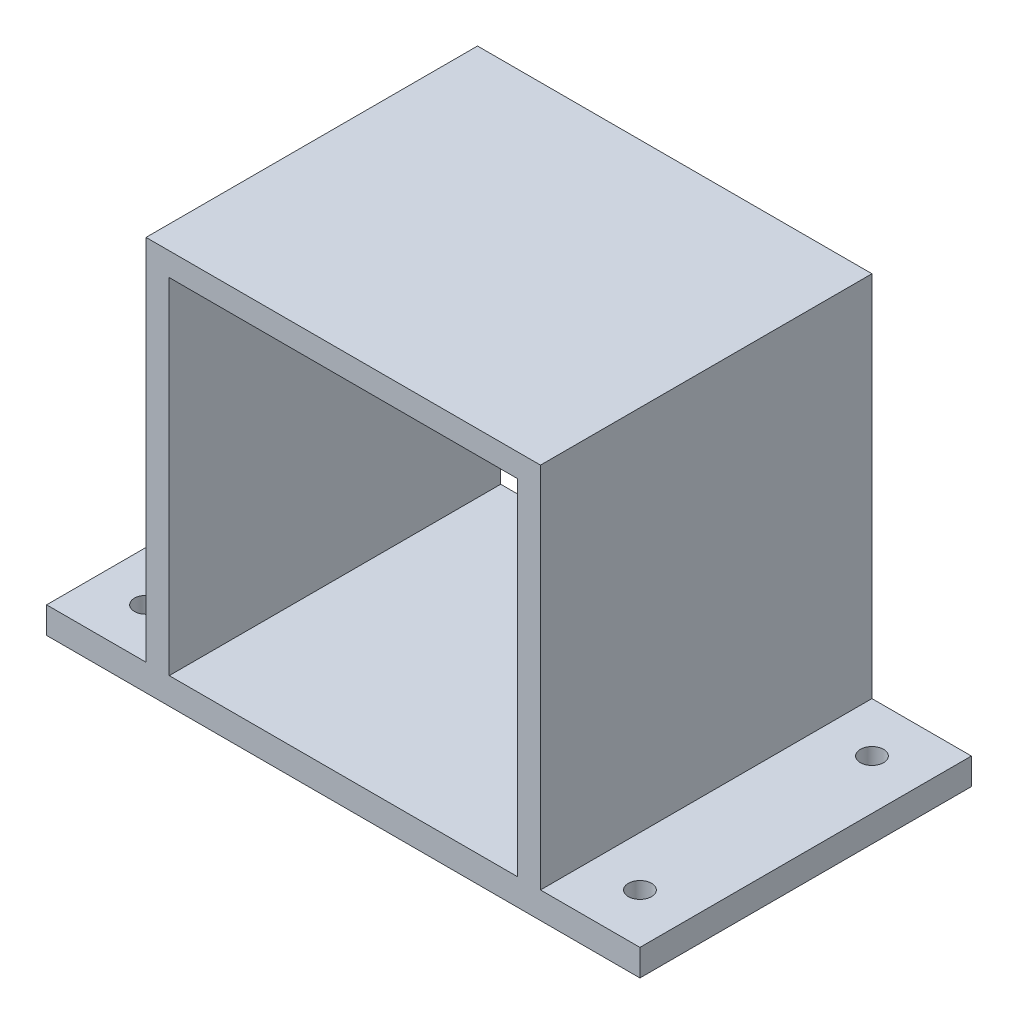
ISO-10303-21;
HEADER;
FILE_DESCRIPTION(('STEP AP214'),'2;1');
FILE_NAME('part.step','',(''),(''),'','','');
FILE_SCHEMA(('AUTOMOTIVE_DESIGN { 1 0 10303 214 1 1 1 1 }'));
ENDSEC;
DATA;
#1=APPLICATION_CONTEXT('core data for automotive mechanical design processes');
#2=APPLICATION_PROTOCOL_DEFINITION('international standard','automotive_design',2000,#1);
#3=PRODUCT_CONTEXT('',#1,'mechanical');
#4=PRODUCT('Part','Part','',(#3));
#5=PRODUCT_RELATED_PRODUCT_CATEGORY('part','',(#4));
#6=PRODUCT_DEFINITION_FORMATION('','',#4);
#7=PRODUCT_DEFINITION_CONTEXT('part definition',#1,'design');
#8=PRODUCT_DEFINITION('design','',#6,#7);
#9=PRODUCT_DEFINITION_SHAPE('','',#8);
#10=(LENGTH_UNIT() NAMED_UNIT(*) SI_UNIT(.MILLI.,.METRE.));
#11=(NAMED_UNIT(*) PLANE_ANGLE_UNIT() SI_UNIT($,.RADIAN.));
#12=(NAMED_UNIT(*) SI_UNIT($,.STERADIAN.) SOLID_ANGLE_UNIT());
#13=UNCERTAINTY_MEASURE_WITH_UNIT(LENGTH_MEASURE(1.E-05),#10,'distance_accuracy_value','');
#14=(GEOMETRIC_REPRESENTATION_CONTEXT(3) GLOBAL_UNCERTAINTY_ASSIGNED_CONTEXT((#13)) GLOBAL_UNIT_ASSIGNED_CONTEXT((#10,
#11,#12)) REPRESENTATION_CONTEXT('',''));
#15=CARTESIAN_POINT('',(0.,0.,0.));
#16=DIRECTION('',(0.,0.,1.));
#17=DIRECTION('',(1.,0.,0.));
#18=AXIS2_PLACEMENT_3D('',#15,#16,#17);
#19=CARTESIAN_POINT('',(-3.5,56.,50.));
#20=DIRECTION('',(1.,0.,0.));
#21=DIRECTION('',(0.,1.,0.));
#22=AXIS2_PLACEMENT_3D('',#19,#20,#21);
#23=PLANE('',#22);
#24=DIRECTION('',(0.,0.,-1.));
#25=VECTOR('',#24,1.);
#26=CARTESIAN_POINT('',(-3.49999999999999,0.5,50.));
#27=LINE('',#26,#25);
#28=CARTESIAN_POINT('',(-3.49999999999999,0.5,50.));
#29=VERTEX_POINT('',#28);
#30=CARTESIAN_POINT('',(-3.5,0.5,0.));
#31=VERTEX_POINT('',#30);
#32=EDGE_CURVE('E192',#29,#31,#27,.T.);
#33=ORIENTED_EDGE('',*,*,#32,.F.);
#34=DIRECTION('',(0.,-1.,0.));
#35=VECTOR('',#34,1.);
#36=CARTESIAN_POINT('',(-3.5,56.,50.));
#37=LINE('',#36,#35);
#38=CARTESIAN_POINT('',(-3.5,56.,50.));
#39=VERTEX_POINT('',#38);
#40=EDGE_CURVE('E132',#39,#29,#37,.T.);
#41=ORIENTED_EDGE('',*,*,#40,.F.);
#42=DIRECTION('',(0.,0.,-1.));
#43=VECTOR('',#42,1.);
#44=CARTESIAN_POINT('',(-3.5,56.,50.));
#45=LINE('',#44,#43);
#46=CARTESIAN_POINT('',(-3.5,56.,0.));
#47=VERTEX_POINT('',#46);
#48=EDGE_CURVE('E236',#39,#47,#45,.T.);
#49=ORIENTED_EDGE('',*,*,#48,.T.);
#50=DIRECTION('',(0.,-1.,0.));
#51=VECTOR('',#50,1.);
#52=CARTESIAN_POINT('',(-3.5,56.,0.));
#53=LINE('',#52,#51);
#54=EDGE_CURVE('E224',#47,#31,#53,.T.);
#55=ORIENTED_EDGE('',*,*,#54,.T.);
#56=EDGE_LOOP('',(#33,#41,#49,#55));
#57=FACE_BOUND('',#56,.T.);
#58=ADVANCED_FACE('F39',(#57),#23,.F.);
#59=CARTESIAN_POINT('',(56.,56.,50.));
#60=DIRECTION('',(-1.,0.,0.));
#61=DIRECTION('',(0.,-1.,0.));
#62=AXIS2_PLACEMENT_3D('',#59,#60,#61);
#63=PLANE('',#62);
#64=DIRECTION('',(0.,0.,1.));
#65=VECTOR('',#64,1.);
#66=CARTESIAN_POINT('',(56.,0.5,50.));
#67=LINE('',#66,#65);
#68=CARTESIAN_POINT('',(56.,0.500000000000014,0.));
#69=VERTEX_POINT('',#68);
#70=CARTESIAN_POINT('',(56.,0.500000000000014,50.));
#71=VERTEX_POINT('',#70);
#72=EDGE_CURVE('E58',#69,#71,#67,.T.);
#73=ORIENTED_EDGE('',*,*,#72,.F.);
#74=DIRECTION('',(0.,1.,0.));
#75=VECTOR('',#74,1.);
#76=CARTESIAN_POINT('',(56.,56.,0.));
#77=LINE('',#76,#75);
#78=CARTESIAN_POINT('',(56.,56.,0.));
#79=VERTEX_POINT('',#78);
#80=EDGE_CURVE('E243',#69,#79,#77,.T.);
#81=ORIENTED_EDGE('',*,*,#80,.T.);
#82=DIRECTION('',(0.,0.,-1.));
#83=VECTOR('',#82,1.);
#84=CARTESIAN_POINT('',(56.,56.,50.));
#85=LINE('',#84,#83);
#86=CARTESIAN_POINT('',(56.,56.,50.));
#87=VERTEX_POINT('',#86);
#88=EDGE_CURVE('E47',#87,#79,#85,.T.);
#89=ORIENTED_EDGE('',*,*,#88,.F.);
#90=DIRECTION('',(0.,1.,0.));
#91=VECTOR('',#90,1.);
#92=CARTESIAN_POINT('',(56.,56.,50.));
#93=LINE('',#92,#91);
#94=EDGE_CURVE('E54',#71,#87,#93,.T.);
#95=ORIENTED_EDGE('',*,*,#94,.F.);
#96=EDGE_LOOP('',(#73,#81,#89,#95));
#97=FACE_BOUND('',#96,.T.);
#98=ADVANCED_FACE('F263',(#97),#63,.F.);
#99=CARTESIAN_POINT('',(0.,0.,50.));
#100=DIRECTION('',(1.,0.,0.));
#101=DIRECTION('',(0.,0.,-1.));
#102=AXIS2_PLACEMENT_3D('',#99,#100,#101);
#103=PLANE('',#102);
#104=DIRECTION('',(0.,-1.,0.));
#105=VECTOR('',#104,1.);
#106=CARTESIAN_POINT('',(0.,0.,50.));
#107=LINE('',#106,#105);
#108=CARTESIAN_POINT('',(0.,52.5,50.));
#109=VERTEX_POINT('',#108);
#110=CARTESIAN_POINT('',(0.,0.5,50.));
#111=VERTEX_POINT('',#110);
#112=EDGE_CURVE('E196',#109,#111,#107,.T.);
#113=ORIENTED_EDGE('',*,*,#112,.T.);
#114=DIRECTION('',(0.,0.,-1.));
#115=VECTOR('',#114,1.);
#116=CARTESIAN_POINT('',(0.,0.5,50.));
#117=LINE('',#116,#115);
#118=CARTESIAN_POINT('',(0.,0.5,0.));
#119=VERTEX_POINT('',#118);
#120=EDGE_CURVE('E180',#111,#119,#117,.T.);
#121=ORIENTED_EDGE('',*,*,#120,.T.);
#122=DIRECTION('',(0.,-1.,0.));
#123=VECTOR('',#122,1.);
#124=CARTESIAN_POINT('',(0.,0.,0.));
#125=LINE('',#124,#123);
#126=CARTESIAN_POINT('',(0.,52.5,0.));
#127=VERTEX_POINT('',#126);
#128=EDGE_CURVE('E195',#127,#119,#125,.T.);
#129=ORIENTED_EDGE('',*,*,#128,.F.);
#130=DIRECTION('',(0.,0.,-1.));
#131=VECTOR('',#130,1.);
#132=CARTESIAN_POINT('',(0.,52.5,50.));
#133=LINE('',#132,#131);
#134=EDGE_CURVE('E207',#109,#127,#133,.T.);
#135=ORIENTED_EDGE('',*,*,#134,.F.);
#136=EDGE_LOOP('',(#113,#121,#129,#135));
#137=FACE_BOUND('',#136,.T.);
#138=ADVANCED_FACE('F267',(#137),#103,.T.);
#139=CARTESIAN_POINT('',(52.5,0.,50.));
#140=DIRECTION('',(-1.,0.,0.));
#141=DIRECTION('',(0.,0.,1.));
#142=AXIS2_PLACEMENT_3D('',#139,#140,#141);
#143=PLANE('',#142);
#144=DIRECTION('',(0.,1.,0.));
#145=VECTOR('',#144,1.);
#146=CARTESIAN_POINT('',(52.5,0.,0.));
#147=LINE('',#146,#145);
#148=CARTESIAN_POINT('',(52.5,0.5,0.));
#149=VERTEX_POINT('',#148);
#150=CARTESIAN_POINT('',(52.5,52.5,0.));
#151=VERTEX_POINT('',#150);
#152=EDGE_CURVE('E211',#149,#151,#147,.T.);
#153=ORIENTED_EDGE('',*,*,#152,.F.);
#154=DIRECTION('',(0.,0.,1.));
#155=VECTOR('',#154,1.);
#156=CARTESIAN_POINT('',(52.5,0.5,50.));
#157=LINE('',#156,#155);
#158=CARTESIAN_POINT('',(52.5,0.5,50.));
#159=VERTEX_POINT('',#158);
#160=EDGE_CURVE('E11',#149,#159,#157,.T.);
#161=ORIENTED_EDGE('',*,*,#160,.T.);
#162=DIRECTION('',(0.,1.,0.));
#163=VECTOR('',#162,1.);
#164=CARTESIAN_POINT('',(52.5,0.,50.));
#165=LINE('',#164,#163);
#166=CARTESIAN_POINT('',(52.5,52.5,50.));
#167=VERTEX_POINT('',#166);
#168=EDGE_CURVE('E200',#159,#167,#165,.T.);
#169=ORIENTED_EDGE('',*,*,#168,.T.);
#170=DIRECTION('',(0.,0.,-1.));
#171=VECTOR('',#170,1.);
#172=CARTESIAN_POINT('',(52.5,52.5,50.));
#173=LINE('',#172,#171);
#174=EDGE_CURVE('E220',#167,#151,#173,.T.);
#175=ORIENTED_EDGE('',*,*,#174,.T.);
#176=EDGE_LOOP('',(#153,#161,#169,#175));
#177=FACE_BOUND('',#176,.T.);
#178=ADVANCED_FACE('F272',(#177),#143,.T.);
#179=CARTESIAN_POINT('',(0.,0.,50.));
#180=DIRECTION('',(0.,0.,1.));
#181=DIRECTION('',(1.,0.,0.));
#182=AXIS2_PLACEMENT_3D('',#179,#180,#181);
#183=PLANE('',#182);
#184=DIRECTION('',(-1.,0.,0.));
#185=VECTOR('',#184,1.);
#186=CARTESIAN_POINT('',(-3.49999999999999,0.5,50.));
#187=LINE('',#186,#185);
#188=EDGE_CURVE('E137',#159,#111,#187,.T.);
#189=ORIENTED_EDGE('',*,*,#188,.T.);
#190=ORIENTED_EDGE('',*,*,#112,.F.);
#191=DIRECTION('',(-1.,0.,0.));
#192=VECTOR('',#191,1.);
#193=CARTESIAN_POINT('',(0.,52.5,50.));
#194=LINE('',#193,#192);
#195=EDGE_CURVE('E204',#167,#109,#194,.T.);
#196=ORIENTED_EDGE('',*,*,#195,.F.);
#197=ORIENTED_EDGE('',*,*,#168,.F.);
#198=EDGE_LOOP('',(#189,#190,#196,#197));
#199=FACE_BOUND('',#198,.T.);
#200=ORIENTED_EDGE('',*,*,#40,.T.);
#201=CARTESIAN_POINT('',(-18.5,0.5,50.));
#202=VERTEX_POINT('',#201);
#203=EDGE_CURVE('E126',#29,#202,#187,.T.);
#204=ORIENTED_EDGE('',*,*,#203,.T.);
#205=DIRECTION('',(0.,-1.,0.));
#206=VECTOR('',#205,1.);
#207=CARTESIAN_POINT('',(-18.5,0.5,50.));
#208=LINE('',#207,#206);
#209=CARTESIAN_POINT('',(-18.5,-3.5,50.));
#210=VERTEX_POINT('',#209);
#211=EDGE_CURVE('E129',#202,#210,#208,.T.);
#212=ORIENTED_EDGE('',*,*,#211,.T.);
#213=DIRECTION('',(1.,0.,0.));
#214=VECTOR('',#213,1.);
#215=CARTESIAN_POINT('',(-3.49999999999999,-3.5,50.));
#216=LINE('',#215,#214);
#217=CARTESIAN_POINT('',(71.,-3.5,50.));
#218=VERTEX_POINT('',#217);
#219=EDGE_CURVE('E227',#210,#218,#216,.T.);
#220=ORIENTED_EDGE('',*,*,#219,.T.);
#221=DIRECTION('',(0.,-1.,0.));
#222=VECTOR('',#221,1.);
#223=CARTESIAN_POINT('',(71.,0.5,50.));
#224=LINE('',#223,#222);
#225=CARTESIAN_POINT('',(71.,0.5,50.));
#226=VERTEX_POINT('',#225);
#227=EDGE_CURVE('E176',#226,#218,#224,.T.);
#228=ORIENTED_EDGE('',*,*,#227,.F.);
#229=EDGE_CURVE('E140',#226,#71,#187,.T.);
#230=ORIENTED_EDGE('',*,*,#229,.T.);
#231=ORIENTED_EDGE('',*,*,#94,.T.);
#232=DIRECTION('',(-1.,0.,0.));
#233=VECTOR('',#232,1.);
#234=CARTESIAN_POINT('',(-3.5,56.,50.));
#235=LINE('',#234,#233);
#236=EDGE_CURVE('E233',#87,#39,#235,.T.);
#237=ORIENTED_EDGE('',*,*,#236,.T.);
#238=EDGE_LOOP('',(#200,#204,#212,#220,#228,#230,#231,#237));
#239=FACE_BOUND('',#238,.T.);
#240=ADVANCED_FACE('F128',(#199,#239),#183,.T.);
#241=CARTESIAN_POINT('',(0.,0.,0.));
#242=DIRECTION('',(0.,0.,1.));
#243=DIRECTION('',(1.,0.,0.));
#244=AXIS2_PLACEMENT_3D('',#241,#242,#243);
#245=PLANE('',#244);
#246=ORIENTED_EDGE('',*,*,#128,.T.);
#247=DIRECTION('',(1.,0.,0.));
#248=VECTOR('',#247,1.);
#249=CARTESIAN_POINT('',(-18.5,0.5,0.));
#250=LINE('',#249,#248);
#251=EDGE_CURVE('E161',#119,#149,#250,.T.);
#252=ORIENTED_EDGE('',*,*,#251,.T.);
#253=ORIENTED_EDGE('',*,*,#152,.T.);
#254=DIRECTION('',(-1.,0.,0.));
#255=VECTOR('',#254,1.);
#256=CARTESIAN_POINT('',(0.,52.5,0.));
#257=LINE('',#256,#255);
#258=EDGE_CURVE('E201',#151,#127,#257,.T.);
#259=ORIENTED_EDGE('',*,*,#258,.T.);
#260=EDGE_LOOP('',(#246,#252,#253,#259));
#261=FACE_BOUND('',#260,.T.);
#262=CARTESIAN_POINT('',(-18.5,0.5,0.));
#263=VERTEX_POINT('',#262);
#264=EDGE_CURVE('E155',#263,#31,#250,.T.);
#265=ORIENTED_EDGE('',*,*,#264,.T.);
#266=ORIENTED_EDGE('',*,*,#54,.F.);
#267=DIRECTION('',(-1.,0.,0.));
#268=VECTOR('',#267,1.);
#269=CARTESIAN_POINT('',(-3.5,56.,0.));
#270=LINE('',#269,#268);
#271=EDGE_CURVE('E228',#79,#47,#270,.T.);
#272=ORIENTED_EDGE('',*,*,#271,.F.);
#273=ORIENTED_EDGE('',*,*,#80,.F.);
#274=CARTESIAN_POINT('',(71.,0.5,0.));
#275=VERTEX_POINT('',#274);
#276=EDGE_CURVE('E157',#69,#275,#250,.T.);
#277=ORIENTED_EDGE('',*,*,#276,.T.);
#278=DIRECTION('',(0.,-1.,0.));
#279=VECTOR('',#278,1.);
#280=CARTESIAN_POINT('',(71.,0.5,0.));
#281=LINE('',#280,#279);
#282=CARTESIAN_POINT('',(71.,-3.5,0.));
#283=VERTEX_POINT('',#282);
#284=EDGE_CURVE('E181',#275,#283,#281,.T.);
#285=ORIENTED_EDGE('',*,*,#284,.T.);
#286=DIRECTION('',(1.,0.,0.));
#287=VECTOR('',#286,1.);
#288=CARTESIAN_POINT('',(-3.49999999999999,-3.5,0.));
#289=LINE('',#288,#287);
#290=CARTESIAN_POINT('',(-18.5,-3.5,0.));
#291=VERTEX_POINT('',#290);
#292=EDGE_CURVE('E240',#291,#283,#289,.T.);
#293=ORIENTED_EDGE('',*,*,#292,.F.);
#294=DIRECTION('',(0.,-1.,0.));
#295=VECTOR('',#294,1.);
#296=CARTESIAN_POINT('',(-18.5,0.5,0.));
#297=LINE('',#296,#295);
#298=EDGE_CURVE('E149',#263,#291,#297,.T.);
#299=ORIENTED_EDGE('',*,*,#298,.F.);
#300=EDGE_LOOP('',(#265,#266,#272,#273,#277,#285,#293,#299));
#301=FACE_BOUND('',#300,.T.);
#302=ADVANCED_FACE('F259',(#261,#301),#245,.F.);
#303=CARTESIAN_POINT('',(-3.49999999999999,-3.5,50.));
#304=DIRECTION('',(0.,1.,0.));
#305=DIRECTION('',(0.,0.,1.));
#306=AXIS2_PLACEMENT_3D('',#303,#304,#305);
#307=PLANE('',#306);
#308=ORIENTED_EDGE('',*,*,#292,.T.);
#309=DIRECTION('',(0.,0.,1.));
#310=VECTOR('',#309,1.);
#311=CARTESIAN_POINT('',(71.,-3.5,0.));
#312=LINE('',#311,#310);
#313=EDGE_CURVE('E138',#283,#218,#312,.T.);
#314=ORIENTED_EDGE('',*,*,#313,.T.);
#315=ORIENTED_EDGE('',*,*,#219,.F.);
#316=DIRECTION('',(0.,0.,-1.));
#317=VECTOR('',#316,1.);
#318=CARTESIAN_POINT('',(-18.5,-3.5,50.));
#319=LINE('',#318,#317);
#320=EDGE_CURVE('E147',#210,#291,#319,.T.);
#321=ORIENTED_EDGE('',*,*,#320,.T.);
#322=EDGE_LOOP('',(#308,#314,#315,#321));
#323=FACE_BOUND('',#322,.T.);
#324=CARTESIAN_POINT('',(63.5,-3.5,7.49999999999998));
#325=DIRECTION('',(0.,-1.,0.));
#326=DIRECTION('',(0.,0.,1.));
#327=AXIS2_PLACEMENT_3D('',#324,#325,#326);
#328=CIRCLE('',#327,1.75);
#329=CARTESIAN_POINT('',(63.5,-3.5,9.24999999999998));
#330=VERTEX_POINT('',#329);
#331=EDGE_CURVE('E290',#330,#330,#328,.T.);
#332=ORIENTED_EDGE('',*,*,#331,.F.);
#333=EDGE_LOOP('',(#332));
#334=FACE_BOUND('',#333,.T.);
#335=CARTESIAN_POINT('',(63.5,-3.5,42.5));
#336=DIRECTION('',(0.,-1.,0.));
#337=DIRECTION('',(0.,0.,1.));
#338=AXIS2_PLACEMENT_3D('',#335,#336,#337);
#339=CIRCLE('',#338,1.75);
#340=CARTESIAN_POINT('',(63.5,-3.5,44.25));
#341=VERTEX_POINT('',#340);
#342=EDGE_CURVE('E294',#341,#341,#339,.T.);
#343=ORIENTED_EDGE('',*,*,#342,.F.);
#344=EDGE_LOOP('',(#343));
#345=FACE_BOUND('',#344,.T.);
#346=CARTESIAN_POINT('',(-11.,-3.5,42.5));
#347=DIRECTION('',(0.,-1.,0.));
#348=DIRECTION('',(0.,0.,-1.));
#349=AXIS2_PLACEMENT_3D('',#346,#347,#348);
#350=CIRCLE('',#349,1.75);
#351=CARTESIAN_POINT('',(-11.,-3.5,40.75));
#352=VERTEX_POINT('',#351);
#353=EDGE_CURVE('E298',#352,#352,#350,.T.);
#354=ORIENTED_EDGE('',*,*,#353,.F.);
#355=EDGE_LOOP('',(#354));
#356=FACE_BOUND('',#355,.T.);
#357=CARTESIAN_POINT('',(-11.,-3.5,7.5));
#358=DIRECTION('',(0.,-1.,0.));
#359=DIRECTION('',(0.,0.,-1.));
#360=AXIS2_PLACEMENT_3D('',#357,#358,#359);
#361=CIRCLE('',#360,1.75);
#362=CARTESIAN_POINT('',(-11.,-3.5,5.75));
#363=VERTEX_POINT('',#362);
#364=EDGE_CURVE('E301',#363,#363,#361,.T.);
#365=ORIENTED_EDGE('',*,*,#364,.F.);
#366=EDGE_LOOP('',(#365));
#367=FACE_BOUND('',#366,.T.);
#368=ADVANCED_FACE('F277',(#323,#334,#345,#356,#367),#307,.F.);
#369=CARTESIAN_POINT('',(-3.5,56.,50.));
#370=DIRECTION('',(0.,-1.,0.));
#371=DIRECTION('',(0.,0.,-1.));
#372=AXIS2_PLACEMENT_3D('',#369,#370,#371);
#373=PLANE('',#372);
#374=ORIENTED_EDGE('',*,*,#271,.T.);
#375=ORIENTED_EDGE('',*,*,#48,.F.);
#376=ORIENTED_EDGE('',*,*,#236,.F.);
#377=ORIENTED_EDGE('',*,*,#88,.T.);
#378=EDGE_LOOP('',(#374,#375,#376,#377));
#379=FACE_BOUND('',#378,.T.);
#380=ADVANCED_FACE('F255',(#379),#373,.F.);
#381=CARTESIAN_POINT('',(0.,52.5,50.));
#382=DIRECTION('',(0.,-1.,0.));
#383=DIRECTION('',(0.,0.,-1.));
#384=AXIS2_PLACEMENT_3D('',#381,#382,#383);
#385=PLANE('',#384);
#386=ORIENTED_EDGE('',*,*,#258,.F.);
#387=ORIENTED_EDGE('',*,*,#174,.F.);
#388=ORIENTED_EDGE('',*,*,#195,.T.);
#389=ORIENTED_EDGE('',*,*,#134,.T.);
#390=EDGE_LOOP('',(#386,#387,#388,#389));
#391=FACE_BOUND('',#390,.T.);
#392=ADVANCED_FACE('F284',(#391),#385,.T.);
#393=CARTESIAN_POINT('',(0.,0.5,0.));
#394=DIRECTION('',(0.,-1.,0.));
#395=DIRECTION('',(0.,0.,-1.));
#396=AXIS2_PLACEMENT_3D('',#393,#394,#395);
#397=PLANE('',#396);
#398=ORIENTED_EDGE('',*,*,#120,.F.);
#399=ORIENTED_EDGE('',*,*,#188,.F.);
#400=ORIENTED_EDGE('',*,*,#160,.F.);
#401=ORIENTED_EDGE('',*,*,#251,.F.);
#402=EDGE_LOOP('',(#398,#399,#400,#401));
#403=FACE_BOUND('',#402,.T.);
#404=ADVANCED_FACE('F334',(#403),#397,.F.);
#405=CARTESIAN_POINT('',(71.,0.5,0.));
#406=DIRECTION('',(1.,0.,0.));
#407=DIRECTION('',(0.,0.,-1.));
#408=AXIS2_PLACEMENT_3D('',#405,#406,#407);
#409=PLANE('',#408);
#410=ORIENTED_EDGE('',*,*,#313,.F.);
#411=ORIENTED_EDGE('',*,*,#284,.F.);
#412=DIRECTION('',(0.,0.,1.));
#413=VECTOR('',#412,1.);
#414=CARTESIAN_POINT('',(71.,0.5,0.));
#415=LINE('',#414,#413);
#416=EDGE_CURVE('E150',#275,#226,#415,.T.);
#417=ORIENTED_EDGE('',*,*,#416,.T.);
#418=ORIENTED_EDGE('',*,*,#227,.T.);
#419=EDGE_LOOP('',(#410,#411,#417,#418));
#420=FACE_BOUND('',#419,.T.);
#421=ADVANCED_FACE('F337',(#420),#409,.T.);
#422=CARTESIAN_POINT('',(63.5,0.5,42.5));
#423=DIRECTION('',(0.,-1.,0.));
#424=DIRECTION('',(0.,0.,-1.));
#425=AXIS2_PLACEMENT_3D('',#422,#423,#424);
#426=CYLINDRICAL_SURFACE('',#425,1.75);
#427=CARTESIAN_POINT('',(63.5,0.5,42.5));
#428=DIRECTION('',(0.,-1.,0.));
#429=DIRECTION('',(0.,0.,1.));
#430=AXIS2_PLACEMENT_3D('',#427,#428,#429);
#431=CIRCLE('',#430,1.75);
#432=CARTESIAN_POINT('',(63.5,0.5,44.25));
#433=VERTEX_POINT('',#432);
#434=EDGE_CURVE('E450',#433,#433,#431,.T.);
#435=ORIENTED_EDGE('',*,*,#434,.F.);
#436=EDGE_LOOP('',(#435));
#437=FACE_BOUND('',#436,.T.);
#438=ORIENTED_EDGE('',*,*,#342,.T.);
#439=EDGE_LOOP('',(#438));
#440=FACE_BOUND('',#439,.T.);
#441=ADVANCED_FACE('F341',(#437,#440),#426,.F.);
#442=CARTESIAN_POINT('',(63.5,0.5,7.49999999999998));
#443=DIRECTION('',(0.,-1.,0.));
#444=DIRECTION('',(0.,0.,-1.));
#445=AXIS2_PLACEMENT_3D('',#442,#443,#444);
#446=CYLINDRICAL_SURFACE('',#445,1.75);
#447=CARTESIAN_POINT('',(63.5,0.5,7.49999999999998));
#448=DIRECTION('',(0.,-1.,0.));
#449=DIRECTION('',(0.,0.,1.));
#450=AXIS2_PLACEMENT_3D('',#447,#448,#449);
#451=CIRCLE('',#450,1.75);
#452=CARTESIAN_POINT('',(63.5,0.5,9.24999999999998));
#453=VERTEX_POINT('',#452);
#454=EDGE_CURVE('E305',#453,#453,#451,.T.);
#455=ORIENTED_EDGE('',*,*,#454,.F.);
#456=EDGE_LOOP('',(#455));
#457=FACE_BOUND('',#456,.T.);
#458=ORIENTED_EDGE('',*,*,#331,.T.);
#459=EDGE_LOOP('',(#458));
#460=FACE_BOUND('',#459,.T.);
#461=ADVANCED_FACE('F398',(#457,#460),#446,.F.);
#462=ORIENTED_EDGE('',*,*,#454,.T.);
#463=EDGE_LOOP('',(#462));
#464=FACE_BOUND('',#463,.T.);
#465=ORIENTED_EDGE('',*,*,#434,.T.);
#466=EDGE_LOOP('',(#465));
#467=FACE_BOUND('',#466,.T.);
#468=ORIENTED_EDGE('',*,*,#276,.F.);
#469=ORIENTED_EDGE('',*,*,#72,.T.);
#470=ORIENTED_EDGE('',*,*,#229,.F.);
#471=ORIENTED_EDGE('',*,*,#416,.F.);
#472=EDGE_LOOP('',(#468,#469,#470,#471));
#473=FACE_BOUND('',#472,.T.);
#474=ADVANCED_FACE('F339',(#464,#467,#473),#397,.F.);
#475=CARTESIAN_POINT('',(-11.,0.5,7.5));
#476=DIRECTION('',(0.,-1.,0.));
#477=DIRECTION('',(0.,0.,-1.));
#478=AXIS2_PLACEMENT_3D('',#475,#476,#477);
#479=CIRCLE('',#478,1.75);
#480=CARTESIAN_POINT('',(-11.,0.5,5.75));
#481=VERTEX_POINT('',#480);
#482=EDGE_CURVE('E304',#481,#481,#479,.T.);
#483=ORIENTED_EDGE('',*,*,#482,.T.);
#484=EDGE_LOOP('',(#483));
#485=FACE_BOUND('',#484,.T.);
#486=CARTESIAN_POINT('',(-11.,0.5,42.5));
#487=DIRECTION('',(0.,-1.,0.));
#488=DIRECTION('',(0.,0.,-1.));
#489=AXIS2_PLACEMENT_3D('',#486,#487,#488);
#490=CIRCLE('',#489,1.75);
#491=CARTESIAN_POINT('',(-11.,0.5,40.75));
#492=VERTEX_POINT('',#491);
#493=EDGE_CURVE('E172',#492,#492,#490,.T.);
#494=ORIENTED_EDGE('',*,*,#493,.T.);
#495=EDGE_LOOP('',(#494));
#496=FACE_BOUND('',#495,.T.);
#497=ORIENTED_EDGE('',*,*,#203,.F.);
#498=ORIENTED_EDGE('',*,*,#32,.T.);
#499=ORIENTED_EDGE('',*,*,#264,.F.);
#500=DIRECTION('',(0.,0.,-1.));
#501=VECTOR('',#500,1.);
#502=CARTESIAN_POINT('',(-18.5,0.5,50.));
#503=LINE('',#502,#501);
#504=EDGE_CURVE('E145',#202,#263,#503,.T.);
#505=ORIENTED_EDGE('',*,*,#504,.F.);
#506=EDGE_LOOP('',(#497,#498,#499,#505));
#507=FACE_BOUND('',#506,.T.);
#508=ADVANCED_FACE('F153',(#485,#496,#507),#397,.F.);
#509=CARTESIAN_POINT('',(-18.5,0.5,50.));
#510=DIRECTION('',(-1.,0.,0.));
#511=DIRECTION('',(0.,0.,1.));
#512=AXIS2_PLACEMENT_3D('',#509,#510,#511);
#513=PLANE('',#512);
#514=ORIENTED_EDGE('',*,*,#320,.F.);
#515=ORIENTED_EDGE('',*,*,#211,.F.);
#516=ORIENTED_EDGE('',*,*,#504,.T.);
#517=ORIENTED_EDGE('',*,*,#298,.T.);
#518=EDGE_LOOP('',(#514,#515,#516,#517));
#519=FACE_BOUND('',#518,.T.);
#520=ADVANCED_FACE('F143',(#519),#513,.T.);
#521=CARTESIAN_POINT('',(-11.,0.5,42.5));
#522=DIRECTION('',(0.,-1.,0.));
#523=DIRECTION('',(0.,0.,-1.));
#524=AXIS2_PLACEMENT_3D('',#521,#522,#523);
#525=CYLINDRICAL_SURFACE('',#524,1.75);
#526=ORIENTED_EDGE('',*,*,#493,.F.);
#527=EDGE_LOOP('',(#526));
#528=FACE_BOUND('',#527,.T.);
#529=ORIENTED_EDGE('',*,*,#353,.T.);
#530=EDGE_LOOP('',(#529));
#531=FACE_BOUND('',#530,.T.);
#532=ADVANCED_FACE('F319',(#528,#531),#525,.F.);
#533=CARTESIAN_POINT('',(-11.,0.5,7.5));
#534=DIRECTION('',(0.,-1.,0.));
#535=DIRECTION('',(0.,0.,-1.));
#536=AXIS2_PLACEMENT_3D('',#533,#534,#535);
#537=CYLINDRICAL_SURFACE('',#536,1.75);
#538=ORIENTED_EDGE('',*,*,#482,.F.);
#539=EDGE_LOOP('',(#538));
#540=FACE_BOUND('',#539,.T.);
#541=ORIENTED_EDGE('',*,*,#364,.T.);
#542=EDGE_LOOP('',(#541));
#543=FACE_BOUND('',#542,.T.);
#544=ADVANCED_FACE('F321',(#540,#543),#537,.F.);
#545=CLOSED_SHELL('',(#58,#98,#138,#178,#240,#302,#368,#380,#392,#404,#421,#441,#461,#474,#508,
#520,#532,#544));
#546=MANIFOLD_SOLID_BREP('B2',#545);
#547=ADVANCED_BREP_SHAPE_REPRESENTATION('',(#18,#546),#14);
#548=SHAPE_DEFINITION_REPRESENTATION(#9,#547);
ENDSEC;
END-ISO-10303-21;
